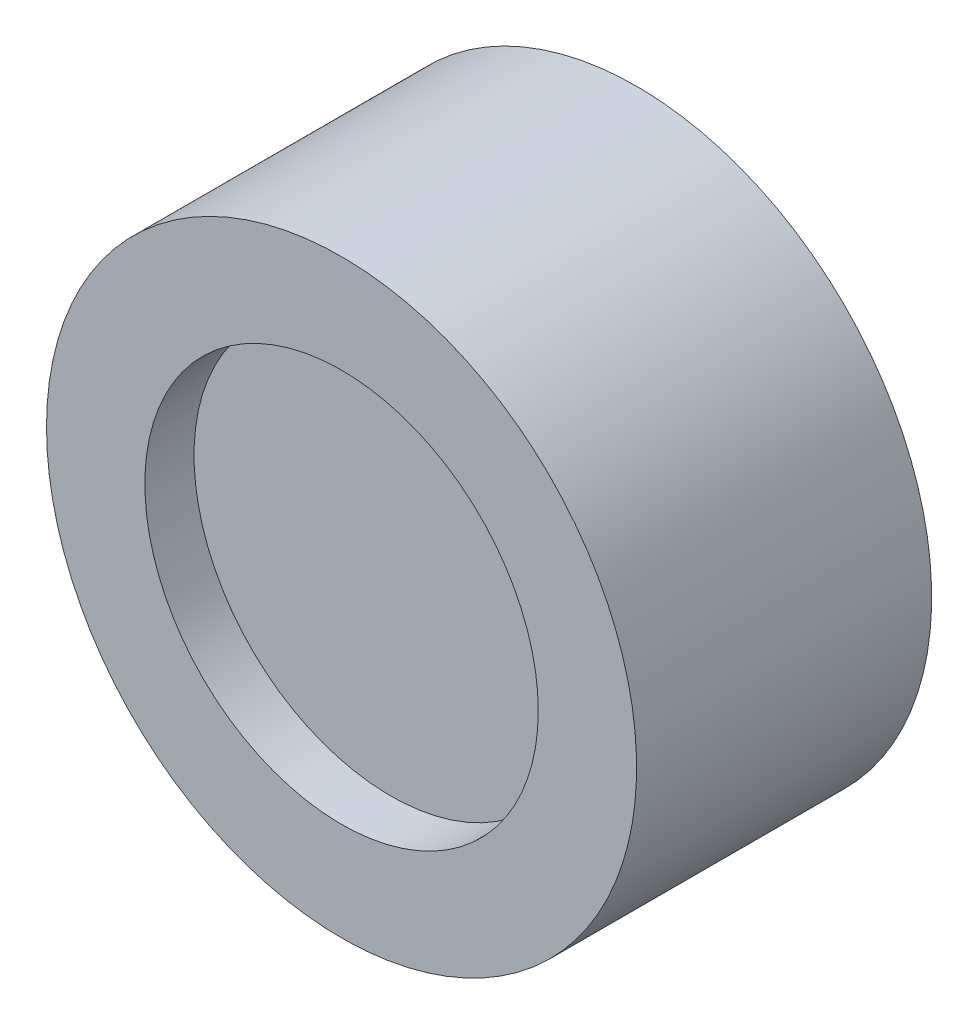
ISO-10303-21;
HEADER;
FILE_DESCRIPTION(('STEP AP214'),'2;1');
FILE_NAME('part.step','',(''),(''),'','','');
FILE_SCHEMA(('AUTOMOTIVE_DESIGN { 1 0 10303 214 1 1 1 1 }'));
ENDSEC;
DATA;
#1=APPLICATION_CONTEXT('core data for automotive mechanical design processes');
#2=APPLICATION_PROTOCOL_DEFINITION('international standard','automotive_design',2000,#1);
#3=PRODUCT_CONTEXT('',#1,'mechanical');
#4=PRODUCT('Part','Part','',(#3));
#5=PRODUCT_RELATED_PRODUCT_CATEGORY('part','',(#4));
#6=PRODUCT_DEFINITION_FORMATION('','',#4);
#7=PRODUCT_DEFINITION_CONTEXT('part definition',#1,'design');
#8=PRODUCT_DEFINITION('design','',#6,#7);
#9=PRODUCT_DEFINITION_SHAPE('','',#8);
#10=(LENGTH_UNIT() NAMED_UNIT(*) SI_UNIT(.MILLI.,.METRE.));
#11=(NAMED_UNIT(*) PLANE_ANGLE_UNIT() SI_UNIT($,.RADIAN.));
#12=(NAMED_UNIT(*) SI_UNIT($,.STERADIAN.) SOLID_ANGLE_UNIT());
#13=UNCERTAINTY_MEASURE_WITH_UNIT(LENGTH_MEASURE(1.E-05),#10,'distance_accuracy_value','');
#14=(GEOMETRIC_REPRESENTATION_CONTEXT(3) GLOBAL_UNCERTAINTY_ASSIGNED_CONTEXT((#13)) GLOBAL_UNIT_ASSIGNED_CONTEXT((#10,
#11,#12)) REPRESENTATION_CONTEXT('',''));
#15=CARTESIAN_POINT('',(0.,0.,0.));
#16=DIRECTION('',(0.,0.,1.));
#17=DIRECTION('',(1.,0.,0.));
#18=AXIS2_PLACEMENT_3D('',#15,#16,#17);
#19=CARTESIAN_POINT('',(0.,0.,38.1));
#20=DIRECTION('',(0.,0.,-1.));
#21=DIRECTION('',(-1.,0.,0.));
#22=AXIS2_PLACEMENT_3D('',#19,#20,#21);
#23=CYLINDRICAL_SURFACE('',#22,38.1);
#24=CARTESIAN_POINT('',(0.,0.,38.1));
#25=DIRECTION('',(0.,0.,1.));
#26=DIRECTION('',(1.,0.,0.));
#27=AXIS2_PLACEMENT_3D('',#24,#25,#26);
#28=CIRCLE('',#27,38.1);
#29=CARTESIAN_POINT('',(-38.1,0.,38.1));
#30=VERTEX_POINT('',#29);
#31=EDGE_CURVE('E10',#30,#30,#28,.T.);
#32=CARTESIAN_POINT('',(0.,0.,0.));
#33=DIRECTION('',(0.,0.,1.));
#34=DIRECTION('',(1.,0.,0.));
#35=AXIS2_PLACEMENT_3D('',#32,#33,#34);
#36=CIRCLE('',#35,38.1);
#37=CARTESIAN_POINT('',(-38.1,0.,0.));
#38=VERTEX_POINT('',#37);
#39=EDGE_CURVE('E37',#38,#38,#36,.T.);
#40=CARTESIAN_POINT('',(-38.1,0.,38.1));
#41=CARTESIAN_POINT('',(-38.1,0.,37.703125));
#42=CARTESIAN_POINT('',(-38.1,0.,37.30625));
#43=CARTESIAN_POINT('',(-38.1,0.,36.5125));
#44=CARTESIAN_POINT('',(-38.1,0.,36.115625));
#45=CARTESIAN_POINT('',(-38.1,0.,35.321875));
#46=CARTESIAN_POINT('',(-38.1,0.,34.925));
#47=CARTESIAN_POINT('',(-38.1,0.,34.13125));
#48=CARTESIAN_POINT('',(-38.1,0.,33.734375));
#49=CARTESIAN_POINT('',(-38.1,0.,32.940625));
#50=CARTESIAN_POINT('',(-38.1,0.,32.54375));
#51=CARTESIAN_POINT('',(-38.1,0.,31.75));
#52=CARTESIAN_POINT('',(-38.1,0.,31.353125));
#53=CARTESIAN_POINT('',(-38.1,0.,30.559375));
#54=CARTESIAN_POINT('',(-38.1,0.,30.1625));
#55=CARTESIAN_POINT('',(-38.1,0.,29.36875));
#56=CARTESIAN_POINT('',(-38.1,0.,28.971875));
#57=CARTESIAN_POINT('',(-38.1,0.,28.178125));
#58=CARTESIAN_POINT('',(-38.1,0.,27.78125));
#59=CARTESIAN_POINT('',(-38.1,0.,26.9875));
#60=CARTESIAN_POINT('',(-38.1,0.,26.590625));
#61=CARTESIAN_POINT('',(-38.1,0.,25.796875));
#62=CARTESIAN_POINT('',(-38.1,0.,25.4));
#63=CARTESIAN_POINT('',(-38.1,0.,24.60625));
#64=CARTESIAN_POINT('',(-38.1,0.,24.209375));
#65=CARTESIAN_POINT('',(-38.1,0.,23.415625));
#66=CARTESIAN_POINT('',(-38.1,0.,23.01875));
#67=CARTESIAN_POINT('',(-38.1,0.,22.225));
#68=CARTESIAN_POINT('',(-38.1,0.,21.828125));
#69=CARTESIAN_POINT('',(-38.1,0.,21.034375));
#70=CARTESIAN_POINT('',(-38.1,0.,20.6375));
#71=CARTESIAN_POINT('',(-38.1,0.,19.84375));
#72=CARTESIAN_POINT('',(-38.1,0.,19.446875));
#73=CARTESIAN_POINT('',(-38.1,0.,18.653125));
#74=CARTESIAN_POINT('',(-38.1,0.,18.25625));
#75=CARTESIAN_POINT('',(-38.1,0.,17.4625));
#76=CARTESIAN_POINT('',(-38.1,0.,17.065625));
#77=CARTESIAN_POINT('',(-38.1,0.,16.271875));
#78=CARTESIAN_POINT('',(-38.1,0.,15.875));
#79=CARTESIAN_POINT('',(-38.1,0.,15.08125));
#80=CARTESIAN_POINT('',(-38.1,0.,14.684375));
#81=CARTESIAN_POINT('',(-38.1,0.,13.890625));
#82=CARTESIAN_POINT('',(-38.1,0.,13.49375));
#83=CARTESIAN_POINT('',(-38.1,0.,12.7));
#84=CARTESIAN_POINT('',(-38.1,0.,12.303125));
#85=CARTESIAN_POINT('',(-38.1,0.,11.509375));
#86=CARTESIAN_POINT('',(-38.1,0.,11.1125));
#87=CARTESIAN_POINT('',(-38.1,0.,10.31875));
#88=CARTESIAN_POINT('',(-38.1,0.,9.92187499999999));
#89=CARTESIAN_POINT('',(-38.1,0.,9.128125));
#90=CARTESIAN_POINT('',(-38.1,0.,8.73124999999999));
#91=CARTESIAN_POINT('',(-38.1,0.,7.93749999999999));
#92=CARTESIAN_POINT('',(-38.1,0.,7.54062499999999));
#93=CARTESIAN_POINT('',(-38.1,0.,6.746875));
#94=CARTESIAN_POINT('',(-38.1,0.,6.35));
#95=CARTESIAN_POINT('',(-38.1,0.,5.55625));
#96=CARTESIAN_POINT('',(-38.1,0.,5.159375));
#97=CARTESIAN_POINT('',(-38.1,0.,4.365625));
#98=CARTESIAN_POINT('',(-38.1,0.,3.96875));
#99=CARTESIAN_POINT('',(-38.1,0.,3.175));
#100=CARTESIAN_POINT('',(-38.1,0.,2.778125));
#101=CARTESIAN_POINT('',(-38.1,0.,1.984375));
#102=CARTESIAN_POINT('',(-38.1,0.,1.5875));
#103=CARTESIAN_POINT('',(-38.1,0.,0.79375));
#104=CARTESIAN_POINT('',(-38.1,0.,0.396875));
#105=CARTESIAN_POINT('',(-38.1,0.,0.));
#106=B_SPLINE_CURVE_WITH_KNOTS('',3,(#40,#41,#42,#43,#44,#45,#46,#47,#48,#49,#50,#51,#52,#53,
#54,#55,#56,#57,#58,#59,#60,#61,#62,#63,#64,#65,#66,#67,#68,#69,#70,#71,#72,#73,#74,#75,#76,#77,
#78,#79,#80,#81,#82,#83,#84,#85,#86,#87,#88,#89,#90,#91,#92,#93,#94,#95,#96,#97,#98,#99,#100,
#101,#102,#103,#104,#105),.UNSPECIFIED.,.F.,.F.,(4,2,2,2,2,2,2,2,2,2,2,2,2,2,2,2,2,2,2,2,2,2,2,
2,2,2,2,2,2,2,2,2,4),(0.,1.190625,2.38125,3.571875,4.7625,5.953125,7.14375,8.334375,
9.52500000000001,10.715625,11.90625,13.096875,14.2875,15.478125,16.66875,17.859375,19.05,
20.240625,21.43125,22.621875,23.8125,25.003125,26.19375,27.384375,28.575,29.765625,30.95625,
32.146875,33.3375,34.528125,35.71875,36.909375,38.1),.UNSPECIFIED.);
#107=EDGE_CURVE('BSEAM34',#30,#38,#106,.T.);
#108=ORIENTED_EDGE('',*,*,#31,.F.);
#109=ORIENTED_EDGE('',*,*,#39,.T.);
#110=ORIENTED_EDGE('',*,*,#107,.T.);
#111=ORIENTED_EDGE('',*,*,#107,.F.);
#112=EDGE_LOOP('',(#108,#110,#109,#111));
#113=FACE_BOUND('',#112,.T.);
#114=ADVANCED_FACE('F34',(#113),#23,.T.);
#115=CARTESIAN_POINT('',(0.,0.,38.1));
#116=DIRECTION('',(0.,0.,1.));
#117=DIRECTION('',(1.,0.,0.));
#118=AXIS2_PLACEMENT_3D('',#115,#116,#117);
#119=PLANE('',#118);
#120=CARTESIAN_POINT('',(0.,0.,38.1));
#121=DIRECTION('',(0.,0.,1.));
#122=DIRECTION('',(1.,0.,0.));
#123=AXIS2_PLACEMENT_3D('',#120,#121,#122);
#124=CIRCLE('',#123,25.4);
#125=CARTESIAN_POINT('',(25.4,0.,38.1));
#126=VERTEX_POINT('',#125);
#127=EDGE_CURVE('E46',#126,#126,#124,.T.);
#128=ORIENTED_EDGE('',*,*,#127,.F.);
#129=EDGE_LOOP('',(#128));
#130=FACE_BOUND('',#129,.T.);
#131=ORIENTED_EDGE('',*,*,#31,.T.);
#132=EDGE_LOOP('',(#131));
#133=FACE_BOUND('',#132,.T.);
#134=ADVANCED_FACE('F61',(#130,#133),#119,.T.);
#135=CARTESIAN_POINT('',(0.,0.,0.));
#136=DIRECTION('',(0.,0.,1.));
#137=DIRECTION('',(1.,0.,0.));
#138=AXIS2_PLACEMENT_3D('',#135,#136,#137);
#139=PLANE('',#138);
#140=ORIENTED_EDGE('',*,*,#39,.F.);
#141=EDGE_LOOP('',(#140));
#142=FACE_BOUND('',#141,.T.);
#143=ADVANCED_FACE('F57',(#142),#139,.F.);
#144=CARTESIAN_POINT('',(0.,0.,31.75));
#145=DIRECTION('',(0.,0.,1.));
#146=DIRECTION('',(1.,0.,0.));
#147=AXIS2_PLACEMENT_3D('',#144,#145,#146);
#148=CYLINDRICAL_SURFACE('',#147,25.4);
#149=CARTESIAN_POINT('',(0.,0.,31.75));
#150=DIRECTION('',(0.,0.,1.));
#151=DIRECTION('',(1.,0.,0.));
#152=AXIS2_PLACEMENT_3D('',#149,#150,#151);
#153=CIRCLE('',#152,25.4);
#154=CARTESIAN_POINT('',(25.4,0.,31.75));
#155=VERTEX_POINT('',#154);
#156=EDGE_CURVE('E44',#155,#155,#153,.T.);
#157=ORIENTED_EDGE('',*,*,#156,.F.);
#158=EDGE_LOOP('',(#157));
#159=FACE_BOUND('',#158,.T.);
#160=ORIENTED_EDGE('',*,*,#127,.T.);
#161=EDGE_LOOP('',(#160));
#162=FACE_BOUND('',#161,.T.);
#163=ADVANCED_FACE('F54',(#159,#162),#148,.F.);
#164=CARTESIAN_POINT('',(0.,0.,31.75));
#165=DIRECTION('',(0.,0.,1.));
#166=DIRECTION('',(1.,0.,0.));
#167=AXIS2_PLACEMENT_3D('',#164,#165,#166);
#168=PLANE('',#167);
#169=ORIENTED_EDGE('',*,*,#156,.T.);
#170=EDGE_LOOP('',(#169));
#171=FACE_BOUND('',#170,.T.);
#172=ADVANCED_FACE('F52',(#171),#168,.T.);
#173=CLOSED_SHELL('',(#114,#134,#143,#163,#172));
#174=MANIFOLD_SOLID_BREP('B2',#173);
#175=ADVANCED_BREP_SHAPE_REPRESENTATION('',(#18,#174),#14);
#176=SHAPE_DEFINITION_REPRESENTATION(#9,#175);
ENDSEC;
END-ISO-10303-21;
